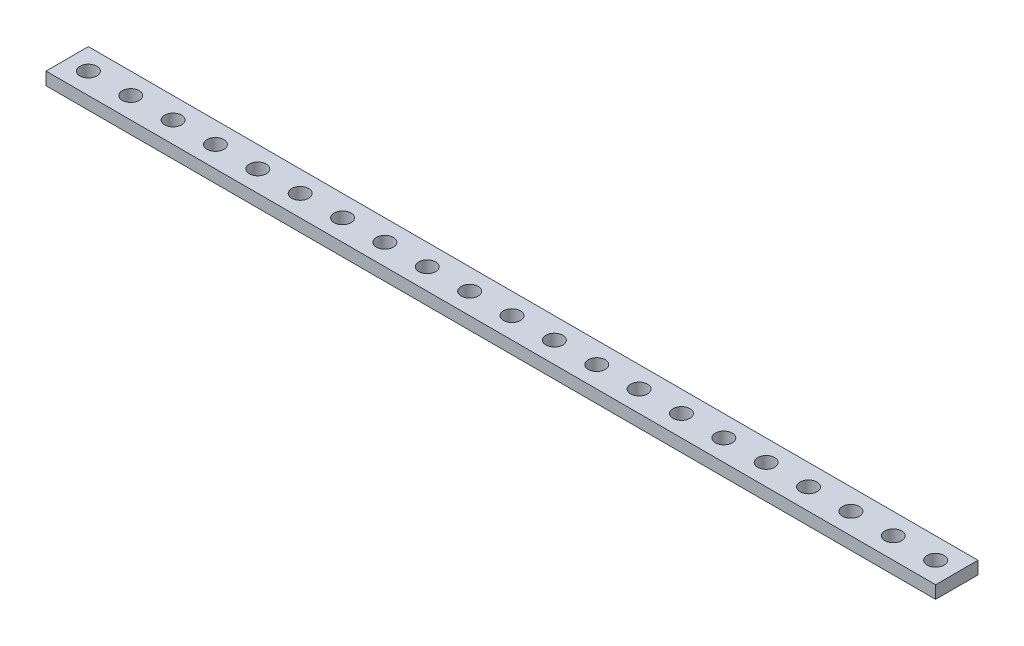
ISO-10303-21;
HEADER;
FILE_DESCRIPTION(('STEP AP214'),'2;1');
FILE_NAME('part.step','',(''),(''),'','','');
FILE_SCHEMA(('AUTOMOTIVE_DESIGN { 1 0 10303 214 1 1 1 1 }'));
ENDSEC;
DATA;
#1=APPLICATION_CONTEXT('core data for automotive mechanical design processes');
#2=APPLICATION_PROTOCOL_DEFINITION('international standard','automotive_design',2000,#1);
#3=PRODUCT_CONTEXT('',#1,'mechanical');
#4=PRODUCT('Part','Part','',(#3));
#5=PRODUCT_RELATED_PRODUCT_CATEGORY('part','',(#4));
#6=PRODUCT_DEFINITION_FORMATION('','',#4);
#7=PRODUCT_DEFINITION_CONTEXT('part definition',#1,'design');
#8=PRODUCT_DEFINITION('design','',#6,#7);
#9=PRODUCT_DEFINITION_SHAPE('','',#8);
#10=(LENGTH_UNIT() NAMED_UNIT(*) SI_UNIT(.MILLI.,.METRE.));
#11=(NAMED_UNIT(*) PLANE_ANGLE_UNIT() SI_UNIT($,.RADIAN.));
#12=(NAMED_UNIT(*) SI_UNIT($,.STERADIAN.) SOLID_ANGLE_UNIT());
#13=UNCERTAINTY_MEASURE_WITH_UNIT(LENGTH_MEASURE(1.E-05),#10,'distance_accuracy_value','');
#14=(GEOMETRIC_REPRESENTATION_CONTEXT(3) GLOBAL_UNCERTAINTY_ASSIGNED_CONTEXT((#13)) GLOBAL_UNIT_ASSIGNED_CONTEXT((#10,
#11,#12)) REPRESENTATION_CONTEXT('',''));
#15=CARTESIAN_POINT('',(0.,0.,0.));
#16=DIRECTION('',(0.,0.,1.));
#17=DIRECTION('',(1.,0.,0.));
#18=AXIS2_PLACEMENT_3D('',#15,#16,#17);
#19=CARTESIAN_POINT('',(0.,3.,0.));
#20=DIRECTION('',(0.,-1.,0.));
#21=DIRECTION('',(0.,0.,-1.));
#22=AXIS2_PLACEMENT_3D('',#19,#20,#21);
#23=PLANE('',#22);
#24=DIRECTION('',(1.,0.,0.));
#25=VECTOR('',#24,1.);
#26=CARTESIAN_POINT('',(0.,3.,0.));
#27=LINE('',#26,#25);
#28=CARTESIAN_POINT('',(-140.,3.,0.));
#29=VERTEX_POINT('',#28);
#30=CARTESIAN_POINT('',(70.,3.,0.));
#31=VERTEX_POINT('',#30);
#32=EDGE_CURVE('E89',#29,#31,#27,.T.);
#33=ORIENTED_EDGE('',*,*,#32,.T.);
#34=DIRECTION('',(0.,0.,1.));
#35=VECTOR('',#34,1.);
#36=CARTESIAN_POINT('',(70.,3.,-10.));
#37=LINE('',#36,#35);
#38=CARTESIAN_POINT('',(70.,3.,-10.));
#39=VERTEX_POINT('',#38);
#40=EDGE_CURVE('E226',#39,#31,#37,.T.);
#41=ORIENTED_EDGE('',*,*,#40,.F.);
#42=DIRECTION('',(-1.,0.,0.));
#43=VECTOR('',#42,1.);
#44=CARTESIAN_POINT('',(-140.,3.,-9.99999999999998));
#45=LINE('',#44,#43);
#46=CARTESIAN_POINT('',(-140.,3.,-9.99999999999998));
#47=VERTEX_POINT('',#46);
#48=EDGE_CURVE('E91',#39,#47,#45,.T.);
#49=ORIENTED_EDGE('',*,*,#48,.T.);
#50=DIRECTION('',(0.,0.,1.));
#51=VECTOR('',#50,1.);
#52=CARTESIAN_POINT('',(-140.,3.,0.));
#53=LINE('',#52,#51);
#54=EDGE_CURVE('E60',#47,#29,#53,.T.);
#55=ORIENTED_EDGE('',*,*,#54,.T.);
#56=EDGE_LOOP('',(#33,#41,#49,#55));
#57=FACE_BOUND('',#56,.T.);
#58=CARTESIAN_POINT('',(-135.,3.,-4.99999999999998));
#59=DIRECTION('',(0.,1.,0.));
#60=DIRECTION('',(0.,0.,1.));
#61=AXIS2_PLACEMENT_3D('',#58,#59,#60);
#62=CIRCLE('',#61,2.);
#63=CARTESIAN_POINT('',(-135.,3.,-2.99999999999999));
#64=VERTEX_POINT('',#63);
#65=EDGE_CURVE('E83',#64,#64,#62,.T.);
#66=ORIENTED_EDGE('',*,*,#65,.F.);
#67=EDGE_LOOP('',(#66));
#68=FACE_BOUND('',#67,.T.);
#69=CARTESIAN_POINT('',(-125.,3.,-4.99999999999998));
#70=DIRECTION('',(0.,1.,0.));
#71=DIRECTION('',(0.,0.,1.));
#72=AXIS2_PLACEMENT_3D('',#69,#70,#71);
#73=CIRCLE('',#72,1.99999999999998);
#74=CARTESIAN_POINT('',(-125.,3.,-3.));
#75=VERTEX_POINT('',#74);
#76=EDGE_CURVE('E100',#75,#75,#73,.T.);
#77=ORIENTED_EDGE('',*,*,#76,.F.);
#78=EDGE_LOOP('',(#77));
#79=FACE_BOUND('',#78,.T.);
#80=CARTESIAN_POINT('',(-115.,3.,-4.99999999999998));
#81=DIRECTION('',(0.,1.,0.));
#82=DIRECTION('',(0.,0.,1.));
#83=AXIS2_PLACEMENT_3D('',#80,#81,#82);
#84=CIRCLE('',#83,2.);
#85=CARTESIAN_POINT('',(-115.,3.,-2.99999999999999));
#86=VERTEX_POINT('',#85);
#87=EDGE_CURVE('E106',#86,#86,#84,.T.);
#88=ORIENTED_EDGE('',*,*,#87,.F.);
#89=EDGE_LOOP('',(#88));
#90=FACE_BOUND('',#89,.T.);
#91=CARTESIAN_POINT('',(-105.,3.,-4.99999999999998));
#92=DIRECTION('',(0.,1.,0.));
#93=DIRECTION('',(0.,0.,1.));
#94=AXIS2_PLACEMENT_3D('',#91,#92,#93);
#95=CIRCLE('',#94,2.);
#96=CARTESIAN_POINT('',(-105.,3.,-2.99999999999999));
#97=VERTEX_POINT('',#96);
#98=EDGE_CURVE('E112',#97,#97,#95,.T.);
#99=ORIENTED_EDGE('',*,*,#98,.F.);
#100=EDGE_LOOP('',(#99));
#101=FACE_BOUND('',#100,.T.);
#102=CARTESIAN_POINT('',(-95.,3.,-4.99999999999998));
#103=DIRECTION('',(0.,1.,0.));
#104=DIRECTION('',(0.,0.,1.));
#105=AXIS2_PLACEMENT_3D('',#102,#103,#104);
#106=CIRCLE('',#105,2.);
#107=CARTESIAN_POINT('',(-95.,3.,-2.99999999999999));
#108=VERTEX_POINT('',#107);
#109=EDGE_CURVE('E118',#108,#108,#106,.T.);
#110=ORIENTED_EDGE('',*,*,#109,.F.);
#111=EDGE_LOOP('',(#110));
#112=FACE_BOUND('',#111,.T.);
#113=CARTESIAN_POINT('',(-85.,3.,-4.99999999999998));
#114=DIRECTION('',(0.,1.,0.));
#115=DIRECTION('',(0.,0.,1.));
#116=AXIS2_PLACEMENT_3D('',#113,#114,#115);
#117=CIRCLE('',#116,2.);
#118=CARTESIAN_POINT('',(-85.,3.,-2.99999999999999));
#119=VERTEX_POINT('',#118);
#120=EDGE_CURVE('E124',#119,#119,#117,.T.);
#121=ORIENTED_EDGE('',*,*,#120,.F.);
#122=EDGE_LOOP('',(#121));
#123=FACE_BOUND('',#122,.T.);
#124=CARTESIAN_POINT('',(-75.,3.,-4.99999999999998));
#125=DIRECTION('',(0.,1.,0.));
#126=DIRECTION('',(0.,0.,1.));
#127=AXIS2_PLACEMENT_3D('',#124,#125,#126);
#128=CIRCLE('',#127,2.);
#129=CARTESIAN_POINT('',(-75.,3.,-2.99999999999999));
#130=VERTEX_POINT('',#129);
#131=EDGE_CURVE('E130',#130,#130,#128,.T.);
#132=ORIENTED_EDGE('',*,*,#131,.F.);
#133=EDGE_LOOP('',(#132));
#134=FACE_BOUND('',#133,.T.);
#135=CARTESIAN_POINT('',(-65.,3.,-4.99999999999998));
#136=DIRECTION('',(0.,1.,0.));
#137=DIRECTION('',(0.,0.,1.));
#138=AXIS2_PLACEMENT_3D('',#135,#136,#137);
#139=CIRCLE('',#138,2.);
#140=CARTESIAN_POINT('',(-65.,3.,-2.99999999999999));
#141=VERTEX_POINT('',#140);
#142=EDGE_CURVE('E136',#141,#141,#139,.T.);
#143=ORIENTED_EDGE('',*,*,#142,.F.);
#144=EDGE_LOOP('',(#143));
#145=FACE_BOUND('',#144,.T.);
#146=CARTESIAN_POINT('',(-55.,3.,-4.99999999999998));
#147=DIRECTION('',(0.,1.,0.));
#148=DIRECTION('',(0.,0.,1.));
#149=AXIS2_PLACEMENT_3D('',#146,#147,#148);
#150=CIRCLE('',#149,2.);
#151=CARTESIAN_POINT('',(-55.,3.,-2.99999999999999));
#152=VERTEX_POINT('',#151);
#153=EDGE_CURVE('E142',#152,#152,#150,.T.);
#154=ORIENTED_EDGE('',*,*,#153,.F.);
#155=EDGE_LOOP('',(#154));
#156=FACE_BOUND('',#155,.T.);
#157=CARTESIAN_POINT('',(-45.,3.,-4.99999999999998));
#158=DIRECTION('',(0.,1.,0.));
#159=DIRECTION('',(0.,0.,1.));
#160=AXIS2_PLACEMENT_3D('',#157,#158,#159);
#161=CIRCLE('',#160,2.);
#162=CARTESIAN_POINT('',(-45.,3.,-2.99999999999999));
#163=VERTEX_POINT('',#162);
#164=EDGE_CURVE('E148',#163,#163,#161,.T.);
#165=ORIENTED_EDGE('',*,*,#164,.F.);
#166=EDGE_LOOP('',(#165));
#167=FACE_BOUND('',#166,.T.);
#168=CARTESIAN_POINT('',(-35.,3.,-4.99999999999998));
#169=DIRECTION('',(0.,1.,0.));
#170=DIRECTION('',(0.,0.,1.));
#171=AXIS2_PLACEMENT_3D('',#168,#169,#170);
#172=CIRCLE('',#171,2.);
#173=CARTESIAN_POINT('',(-35.,3.,-2.99999999999999));
#174=VERTEX_POINT('',#173);
#175=EDGE_CURVE('E154',#174,#174,#172,.T.);
#176=ORIENTED_EDGE('',*,*,#175,.F.);
#177=EDGE_LOOP('',(#176));
#178=FACE_BOUND('',#177,.T.);
#179=CARTESIAN_POINT('',(-25.,3.,-4.99999999999998));
#180=DIRECTION('',(0.,1.,0.));
#181=DIRECTION('',(0.,0.,1.));
#182=AXIS2_PLACEMENT_3D('',#179,#180,#181);
#183=CIRCLE('',#182,2.);
#184=CARTESIAN_POINT('',(-25.,3.,-2.99999999999999));
#185=VERTEX_POINT('',#184);
#186=EDGE_CURVE('E160',#185,#185,#183,.T.);
#187=ORIENTED_EDGE('',*,*,#186,.F.);
#188=EDGE_LOOP('',(#187));
#189=FACE_BOUND('',#188,.T.);
#190=CARTESIAN_POINT('',(-15.,3.,-4.99999999999998));
#191=DIRECTION('',(0.,1.,0.));
#192=DIRECTION('',(0.,0.,1.));
#193=AXIS2_PLACEMENT_3D('',#190,#191,#192);
#194=CIRCLE('',#193,2.);
#195=CARTESIAN_POINT('',(-15.,3.,-2.99999999999999));
#196=VERTEX_POINT('',#195);
#197=EDGE_CURVE('E166',#196,#196,#194,.T.);
#198=ORIENTED_EDGE('',*,*,#197,.F.);
#199=EDGE_LOOP('',(#198));
#200=FACE_BOUND('',#199,.T.);
#201=CARTESIAN_POINT('',(-5.,3.,-4.99999999999998));
#202=DIRECTION('',(0.,1.,0.));
#203=DIRECTION('',(0.,0.,1.));
#204=AXIS2_PLACEMENT_3D('',#201,#202,#203);
#205=CIRCLE('',#204,2.);
#206=CARTESIAN_POINT('',(-5.,3.,-2.99999999999999));
#207=VERTEX_POINT('',#206);
#208=EDGE_CURVE('E172',#207,#207,#205,.T.);
#209=ORIENTED_EDGE('',*,*,#208,.F.);
#210=EDGE_LOOP('',(#209));
#211=FACE_BOUND('',#210,.T.);
#212=CARTESIAN_POINT('',(5.,3.,-4.99999999999998));
#213=DIRECTION('',(0.,1.,0.));
#214=DIRECTION('',(0.,0.,1.));
#215=AXIS2_PLACEMENT_3D('',#212,#213,#214);
#216=CIRCLE('',#215,2.);
#217=CARTESIAN_POINT('',(5.,3.,-2.99999999999999));
#218=VERTEX_POINT('',#217);
#219=EDGE_CURVE('E178',#218,#218,#216,.T.);
#220=ORIENTED_EDGE('',*,*,#219,.F.);
#221=EDGE_LOOP('',(#220));
#222=FACE_BOUND('',#221,.T.);
#223=CARTESIAN_POINT('',(15.,3.,-4.99999999999998));
#224=DIRECTION('',(0.,1.,0.));
#225=DIRECTION('',(0.,0.,1.));
#226=AXIS2_PLACEMENT_3D('',#223,#224,#225);
#227=CIRCLE('',#226,2.);
#228=CARTESIAN_POINT('',(15.,3.,-2.99999999999999));
#229=VERTEX_POINT('',#228);
#230=EDGE_CURVE('E184',#229,#229,#227,.T.);
#231=ORIENTED_EDGE('',*,*,#230,.F.);
#232=EDGE_LOOP('',(#231));
#233=FACE_BOUND('',#232,.T.);
#234=CARTESIAN_POINT('',(25.,3.,-4.99999999999998));
#235=DIRECTION('',(0.,1.,0.));
#236=DIRECTION('',(0.,0.,1.));
#237=AXIS2_PLACEMENT_3D('',#234,#235,#236);
#238=CIRCLE('',#237,2.);
#239=CARTESIAN_POINT('',(25.,3.,-2.99999999999999));
#240=VERTEX_POINT('',#239);
#241=EDGE_CURVE('E190',#240,#240,#238,.T.);
#242=ORIENTED_EDGE('',*,*,#241,.F.);
#243=EDGE_LOOP('',(#242));
#244=FACE_BOUND('',#243,.T.);
#245=CARTESIAN_POINT('',(35.,3.,-4.99999999999998));
#246=DIRECTION('',(0.,1.,0.));
#247=DIRECTION('',(0.,0.,1.));
#248=AXIS2_PLACEMENT_3D('',#245,#246,#247);
#249=CIRCLE('',#248,2.);
#250=CARTESIAN_POINT('',(35.,3.,-2.99999999999999));
#251=VERTEX_POINT('',#250);
#252=EDGE_CURVE('E196',#251,#251,#249,.T.);
#253=ORIENTED_EDGE('',*,*,#252,.F.);
#254=EDGE_LOOP('',(#253));
#255=FACE_BOUND('',#254,.T.);
#256=CARTESIAN_POINT('',(45.,3.,-4.99999999999998));
#257=DIRECTION('',(0.,1.,0.));
#258=DIRECTION('',(0.,0.,1.));
#259=AXIS2_PLACEMENT_3D('',#256,#257,#258);
#260=CIRCLE('',#259,2.);
#261=CARTESIAN_POINT('',(45.,3.,-2.99999999999999));
#262=VERTEX_POINT('',#261);
#263=EDGE_CURVE('E202',#262,#262,#260,.T.);
#264=ORIENTED_EDGE('',*,*,#263,.F.);
#265=EDGE_LOOP('',(#264));
#266=FACE_BOUND('',#265,.T.);
#267=CARTESIAN_POINT('',(55.,3.,-4.99999999999998));
#268=DIRECTION('',(0.,1.,0.));
#269=DIRECTION('',(0.,0.,1.));
#270=AXIS2_PLACEMENT_3D('',#267,#268,#269);
#271=CIRCLE('',#270,2.);
#272=CARTESIAN_POINT('',(55.,3.,-2.99999999999999));
#273=VERTEX_POINT('',#272);
#274=EDGE_CURVE('E208',#273,#273,#271,.T.);
#275=ORIENTED_EDGE('',*,*,#274,.F.);
#276=EDGE_LOOP('',(#275));
#277=FACE_BOUND('',#276,.T.);
#278=CARTESIAN_POINT('',(65.,3.,-4.99999999999998));
#279=DIRECTION('',(0.,1.,0.));
#280=DIRECTION('',(0.,0.,1.));
#281=AXIS2_PLACEMENT_3D('',#278,#279,#280);
#282=CIRCLE('',#281,2.);
#283=CARTESIAN_POINT('',(65.,3.,-2.99999999999999));
#284=VERTEX_POINT('',#283);
#285=EDGE_CURVE('E214',#284,#284,#282,.T.);
#286=ORIENTED_EDGE('',*,*,#285,.F.);
#287=EDGE_LOOP('',(#286));
#288=FACE_BOUND('',#287,.T.);
#289=ADVANCED_FACE('F36',(#57,#68,#79,#90,#101,#112,#123,#134,#145,#156,#167,#178,#189,#200,
#211,#222,#233,#244,#255,#266,#277,#288),#23,.F.);
#290=CARTESIAN_POINT('',(0.,0.,0.));
#291=DIRECTION('',(0.,-1.,0.));
#292=DIRECTION('',(0.,0.,-1.));
#293=AXIS2_PLACEMENT_3D('',#290,#291,#292);
#294=PLANE('',#293);
#295=DIRECTION('',(0.,0.,1.));
#296=VECTOR('',#295,1.);
#297=CARTESIAN_POINT('',(70.,0.,-10.));
#298=LINE('',#297,#296);
#299=CARTESIAN_POINT('',(70.,0.,-9.99999999999998));
#300=VERTEX_POINT('',#299);
#301=CARTESIAN_POINT('',(70.,0.,0.));
#302=VERTEX_POINT('',#301);
#303=EDGE_CURVE('E51',#300,#302,#298,.T.);
#304=ORIENTED_EDGE('',*,*,#303,.T.);
#305=DIRECTION('',(1.,0.,0.));
#306=VECTOR('',#305,1.);
#307=CARTESIAN_POINT('',(0.,0.,0.));
#308=LINE('',#307,#306);
#309=CARTESIAN_POINT('',(-140.,0.,0.));
#310=VERTEX_POINT('',#309);
#311=EDGE_CURVE('E73',#310,#302,#308,.T.);
#312=ORIENTED_EDGE('',*,*,#311,.F.);
#313=DIRECTION('',(0.,0.,1.));
#314=VECTOR('',#313,1.);
#315=CARTESIAN_POINT('',(-140.,0.,0.));
#316=LINE('',#315,#314);
#317=CARTESIAN_POINT('',(-140.,0.,-9.99999999999998));
#318=VERTEX_POINT('',#317);
#319=EDGE_CURVE('E78',#318,#310,#316,.T.);
#320=ORIENTED_EDGE('',*,*,#319,.F.);
#321=DIRECTION('',(-1.,0.,0.));
#322=VECTOR('',#321,1.);
#323=CARTESIAN_POINT('',(-140.,0.,-9.99999999999998));
#324=LINE('',#323,#322);
#325=EDGE_CURVE('E82',#300,#318,#324,.T.);
#326=ORIENTED_EDGE('',*,*,#325,.F.);
#327=EDGE_LOOP('',(#304,#312,#320,#326));
#328=FACE_BOUND('',#327,.T.);
#329=CARTESIAN_POINT('',(65.,0.,-4.99999999999998));
#330=DIRECTION('',(0.,1.,0.));
#331=DIRECTION('',(0.,0.,1.));
#332=AXIS2_PLACEMENT_3D('',#329,#330,#331);
#333=CIRCLE('',#332,2.);
#334=CARTESIAN_POINT('',(65.,0.,-2.99999999999999));
#335=VERTEX_POINT('',#334);
#336=EDGE_CURVE('E217',#335,#335,#333,.T.);
#337=ORIENTED_EDGE('',*,*,#336,.T.);
#338=EDGE_LOOP('',(#337));
#339=FACE_BOUND('',#338,.T.);
#340=CARTESIAN_POINT('',(45.,0.,-4.99999999999998));
#341=DIRECTION('',(0.,1.,0.));
#342=DIRECTION('',(0.,0.,1.));
#343=AXIS2_PLACEMENT_3D('',#340,#341,#342);
#344=CIRCLE('',#343,2.);
#345=CARTESIAN_POINT('',(45.,0.,-2.99999999999999));
#346=VERTEX_POINT('',#345);
#347=EDGE_CURVE('E205',#346,#346,#344,.T.);
#348=ORIENTED_EDGE('',*,*,#347,.T.);
#349=EDGE_LOOP('',(#348));
#350=FACE_BOUND('',#349,.T.);
#351=CARTESIAN_POINT('',(25.,0.,-4.99999999999998));
#352=DIRECTION('',(0.,1.,0.));
#353=DIRECTION('',(0.,0.,1.));
#354=AXIS2_PLACEMENT_3D('',#351,#352,#353);
#355=CIRCLE('',#354,2.);
#356=CARTESIAN_POINT('',(25.,0.,-2.99999999999999));
#357=VERTEX_POINT('',#356);
#358=EDGE_CURVE('E193',#357,#357,#355,.T.);
#359=ORIENTED_EDGE('',*,*,#358,.T.);
#360=EDGE_LOOP('',(#359));
#361=FACE_BOUND('',#360,.T.);
#362=CARTESIAN_POINT('',(5.,0.,-4.99999999999998));
#363=DIRECTION('',(0.,1.,0.));
#364=DIRECTION('',(0.,0.,1.));
#365=AXIS2_PLACEMENT_3D('',#362,#363,#364);
#366=CIRCLE('',#365,2.);
#367=CARTESIAN_POINT('',(5.,0.,-2.99999999999999));
#368=VERTEX_POINT('',#367);
#369=EDGE_CURVE('E181',#368,#368,#366,.T.);
#370=ORIENTED_EDGE('',*,*,#369,.T.);
#371=EDGE_LOOP('',(#370));
#372=FACE_BOUND('',#371,.T.);
#373=CARTESIAN_POINT('',(-15.,0.,-4.99999999999998));
#374=DIRECTION('',(0.,1.,0.));
#375=DIRECTION('',(0.,0.,1.));
#376=AXIS2_PLACEMENT_3D('',#373,#374,#375);
#377=CIRCLE('',#376,2.);
#378=CARTESIAN_POINT('',(-15.,0.,-2.99999999999999));
#379=VERTEX_POINT('',#378);
#380=EDGE_CURVE('E169',#379,#379,#377,.T.);
#381=ORIENTED_EDGE('',*,*,#380,.T.);
#382=EDGE_LOOP('',(#381));
#383=FACE_BOUND('',#382,.T.);
#384=CARTESIAN_POINT('',(-35.,0.,-4.99999999999998));
#385=DIRECTION('',(0.,1.,0.));
#386=DIRECTION('',(0.,0.,1.));
#387=AXIS2_PLACEMENT_3D('',#384,#385,#386);
#388=CIRCLE('',#387,2.);
#389=CARTESIAN_POINT('',(-35.,0.,-2.99999999999999));
#390=VERTEX_POINT('',#389);
#391=EDGE_CURVE('E157',#390,#390,#388,.T.);
#392=ORIENTED_EDGE('',*,*,#391,.T.);
#393=EDGE_LOOP('',(#392));
#394=FACE_BOUND('',#393,.T.);
#395=CARTESIAN_POINT('',(-55.,0.,-4.99999999999998));
#396=DIRECTION('',(0.,1.,0.));
#397=DIRECTION('',(0.,0.,1.));
#398=AXIS2_PLACEMENT_3D('',#395,#396,#397);
#399=CIRCLE('',#398,2.);
#400=CARTESIAN_POINT('',(-55.,0.,-2.99999999999999));
#401=VERTEX_POINT('',#400);
#402=EDGE_CURVE('E145',#401,#401,#399,.T.);
#403=ORIENTED_EDGE('',*,*,#402,.T.);
#404=EDGE_LOOP('',(#403));
#405=FACE_BOUND('',#404,.T.);
#406=CARTESIAN_POINT('',(-75.,0.,-4.99999999999998));
#407=DIRECTION('',(0.,1.,0.));
#408=DIRECTION('',(0.,0.,1.));
#409=AXIS2_PLACEMENT_3D('',#406,#407,#408);
#410=CIRCLE('',#409,2.);
#411=CARTESIAN_POINT('',(-75.,0.,-2.99999999999999));
#412=VERTEX_POINT('',#411);
#413=EDGE_CURVE('E133',#412,#412,#410,.T.);
#414=ORIENTED_EDGE('',*,*,#413,.T.);
#415=EDGE_LOOP('',(#414));
#416=FACE_BOUND('',#415,.T.);
#417=CARTESIAN_POINT('',(-95.,0.,-4.99999999999998));
#418=DIRECTION('',(0.,1.,0.));
#419=DIRECTION('',(0.,0.,1.));
#420=AXIS2_PLACEMENT_3D('',#417,#418,#419);
#421=CIRCLE('',#420,2.);
#422=CARTESIAN_POINT('',(-95.,0.,-2.99999999999999));
#423=VERTEX_POINT('',#422);
#424=EDGE_CURVE('E121',#423,#423,#421,.T.);
#425=ORIENTED_EDGE('',*,*,#424,.T.);
#426=EDGE_LOOP('',(#425));
#427=FACE_BOUND('',#426,.T.);
#428=CARTESIAN_POINT('',(-115.,0.,-4.99999999999998));
#429=DIRECTION('',(0.,1.,0.));
#430=DIRECTION('',(0.,0.,1.));
#431=AXIS2_PLACEMENT_3D('',#428,#429,#430);
#432=CIRCLE('',#431,2.);
#433=CARTESIAN_POINT('',(-115.,0.,-2.99999999999999));
#434=VERTEX_POINT('',#433);
#435=EDGE_CURVE('E109',#434,#434,#432,.T.);
#436=ORIENTED_EDGE('',*,*,#435,.T.);
#437=EDGE_LOOP('',(#436));
#438=FACE_BOUND('',#437,.T.);
#439=CARTESIAN_POINT('',(-135.,0.,-4.99999999999998));
#440=DIRECTION('',(0.,1.,0.));
#441=DIRECTION('',(0.,0.,1.));
#442=AXIS2_PLACEMENT_3D('',#439,#440,#441);
#443=CIRCLE('',#442,2.);
#444=CARTESIAN_POINT('',(-135.,0.,-2.99999999999999));
#445=VERTEX_POINT('',#444);
#446=EDGE_CURVE('E97',#445,#445,#443,.T.);
#447=ORIENTED_EDGE('',*,*,#446,.T.);
#448=EDGE_LOOP('',(#447));
#449=FACE_BOUND('',#448,.T.);
#450=CARTESIAN_POINT('',(-125.,0.,-4.99999999999998));
#451=DIRECTION('',(0.,1.,0.));
#452=DIRECTION('',(0.,0.,1.));
#453=AXIS2_PLACEMENT_3D('',#450,#451,#452);
#454=CIRCLE('',#453,1.99999999999998);
#455=CARTESIAN_POINT('',(-125.,0.,-3.));
#456=VERTEX_POINT('',#455);
#457=EDGE_CURVE('E103',#456,#456,#454,.T.);
#458=ORIENTED_EDGE('',*,*,#457,.T.);
#459=EDGE_LOOP('',(#458));
#460=FACE_BOUND('',#459,.T.);
#461=CARTESIAN_POINT('',(-105.,0.,-4.99999999999998));
#462=DIRECTION('',(0.,1.,0.));
#463=DIRECTION('',(0.,0.,1.));
#464=AXIS2_PLACEMENT_3D('',#461,#462,#463);
#465=CIRCLE('',#464,2.);
#466=CARTESIAN_POINT('',(-105.,0.,-2.99999999999999));
#467=VERTEX_POINT('',#466);
#468=EDGE_CURVE('E115',#467,#467,#465,.T.);
#469=ORIENTED_EDGE('',*,*,#468,.T.);
#470=EDGE_LOOP('',(#469));
#471=FACE_BOUND('',#470,.T.);
#472=CARTESIAN_POINT('',(-85.,0.,-4.99999999999998));
#473=DIRECTION('',(0.,1.,0.));
#474=DIRECTION('',(0.,0.,1.));
#475=AXIS2_PLACEMENT_3D('',#472,#473,#474);
#476=CIRCLE('',#475,2.);
#477=CARTESIAN_POINT('',(-85.,0.,-2.99999999999999));
#478=VERTEX_POINT('',#477);
#479=EDGE_CURVE('E127',#478,#478,#476,.T.);
#480=ORIENTED_EDGE('',*,*,#479,.T.);
#481=EDGE_LOOP('',(#480));
#482=FACE_BOUND('',#481,.T.);
#483=CARTESIAN_POINT('',(-65.,0.,-4.99999999999998));
#484=DIRECTION('',(0.,1.,0.));
#485=DIRECTION('',(0.,0.,1.));
#486=AXIS2_PLACEMENT_3D('',#483,#484,#485);
#487=CIRCLE('',#486,2.);
#488=CARTESIAN_POINT('',(-65.,0.,-2.99999999999999));
#489=VERTEX_POINT('',#488);
#490=EDGE_CURVE('E139',#489,#489,#487,.T.);
#491=ORIENTED_EDGE('',*,*,#490,.T.);
#492=EDGE_LOOP('',(#491));
#493=FACE_BOUND('',#492,.T.);
#494=CARTESIAN_POINT('',(-45.,0.,-4.99999999999998));
#495=DIRECTION('',(0.,1.,0.));
#496=DIRECTION('',(0.,0.,1.));
#497=AXIS2_PLACEMENT_3D('',#494,#495,#496);
#498=CIRCLE('',#497,2.);
#499=CARTESIAN_POINT('',(-45.,0.,-2.99999999999999));
#500=VERTEX_POINT('',#499);
#501=EDGE_CURVE('E151',#500,#500,#498,.T.);
#502=ORIENTED_EDGE('',*,*,#501,.T.);
#503=EDGE_LOOP('',(#502));
#504=FACE_BOUND('',#503,.T.);
#505=CARTESIAN_POINT('',(-25.,0.,-4.99999999999998));
#506=DIRECTION('',(0.,1.,0.));
#507=DIRECTION('',(0.,0.,1.));
#508=AXIS2_PLACEMENT_3D('',#505,#506,#507);
#509=CIRCLE('',#508,2.);
#510=CARTESIAN_POINT('',(-25.,0.,-2.99999999999999));
#511=VERTEX_POINT('',#510);
#512=EDGE_CURVE('E163',#511,#511,#509,.T.);
#513=ORIENTED_EDGE('',*,*,#512,.T.);
#514=EDGE_LOOP('',(#513));
#515=FACE_BOUND('',#514,.T.);
#516=CARTESIAN_POINT('',(-5.,0.,-4.99999999999998));
#517=DIRECTION('',(0.,1.,0.));
#518=DIRECTION('',(0.,0.,1.));
#519=AXIS2_PLACEMENT_3D('',#516,#517,#518);
#520=CIRCLE('',#519,2.);
#521=CARTESIAN_POINT('',(-5.,0.,-2.99999999999999));
#522=VERTEX_POINT('',#521);
#523=EDGE_CURVE('E175',#522,#522,#520,.T.);
#524=ORIENTED_EDGE('',*,*,#523,.T.);
#525=EDGE_LOOP('',(#524));
#526=FACE_BOUND('',#525,.T.);
#527=CARTESIAN_POINT('',(15.,0.,-4.99999999999998));
#528=DIRECTION('',(0.,1.,0.));
#529=DIRECTION('',(0.,0.,1.));
#530=AXIS2_PLACEMENT_3D('',#527,#528,#529);
#531=CIRCLE('',#530,2.);
#532=CARTESIAN_POINT('',(15.,0.,-2.99999999999999));
#533=VERTEX_POINT('',#532);
#534=EDGE_CURVE('E187',#533,#533,#531,.T.);
#535=ORIENTED_EDGE('',*,*,#534,.T.);
#536=EDGE_LOOP('',(#535));
#537=FACE_BOUND('',#536,.T.);
#538=CARTESIAN_POINT('',(35.,0.,-4.99999999999998));
#539=DIRECTION('',(0.,1.,0.));
#540=DIRECTION('',(0.,0.,1.));
#541=AXIS2_PLACEMENT_3D('',#538,#539,#540);
#542=CIRCLE('',#541,2.);
#543=CARTESIAN_POINT('',(35.,0.,-2.99999999999999));
#544=VERTEX_POINT('',#543);
#545=EDGE_CURVE('E199',#544,#544,#542,.T.);
#546=ORIENTED_EDGE('',*,*,#545,.T.);
#547=EDGE_LOOP('',(#546));
#548=FACE_BOUND('',#547,.T.);
#549=CARTESIAN_POINT('',(55.,0.,-4.99999999999998));
#550=DIRECTION('',(0.,1.,0.));
#551=DIRECTION('',(0.,0.,1.));
#552=AXIS2_PLACEMENT_3D('',#549,#550,#551);
#553=CIRCLE('',#552,2.);
#554=CARTESIAN_POINT('',(55.,0.,-2.99999999999999));
#555=VERTEX_POINT('',#554);
#556=EDGE_CURVE('E211',#555,#555,#553,.T.);
#557=ORIENTED_EDGE('',*,*,#556,.T.);
#558=EDGE_LOOP('',(#557));
#559=FACE_BOUND('',#558,.T.);
#560=ADVANCED_FACE('F75',(#328,#339,#350,#361,#372,#383,#394,#405,#416,#427,#438,#449,#460,#471,
#482,#493,#504,#515,#526,#537,#548,#559),#294,.T.);
#561=CARTESIAN_POINT('',(0.,3.,0.));
#562=DIRECTION('',(0.,0.,-1.));
#563=DIRECTION('',(-1.,0.,0.));
#564=AXIS2_PLACEMENT_3D('',#561,#562,#563);
#565=PLANE('',#564);
#566=ORIENTED_EDGE('',*,*,#311,.T.);
#567=DIRECTION('',(0.,1.,0.));
#568=VECTOR('',#567,1.);
#569=CARTESIAN_POINT('',(70.,-0.00100000000000013,0.));
#570=LINE('',#569,#568);
#571=EDGE_CURVE('E223',#302,#31,#570,.T.);
#572=ORIENTED_EDGE('',*,*,#571,.T.);
#573=ORIENTED_EDGE('',*,*,#32,.F.);
#574=DIRECTION('',(0.,-1.,0.));
#575=VECTOR('',#574,1.);
#576=CARTESIAN_POINT('',(-140.,3.,0.));
#577=LINE('',#576,#575);
#578=EDGE_CURVE('E44',#29,#310,#577,.T.);
#579=ORIENTED_EDGE('',*,*,#578,.T.);
#580=EDGE_LOOP('',(#566,#572,#573,#579));
#581=FACE_BOUND('',#580,.T.);
#582=ADVANCED_FACE('F38',(#581),#565,.F.);
#583=CARTESIAN_POINT('',(-140.,3.,-9.99999999999998));
#584=DIRECTION('',(0.,0.,1.));
#585=DIRECTION('',(1.,0.,0.));
#586=AXIS2_PLACEMENT_3D('',#583,#584,#585);
#587=PLANE('',#586);
#588=ORIENTED_EDGE('',*,*,#48,.F.);
#589=DIRECTION('',(0.,1.,0.));
#590=VECTOR('',#589,1.);
#591=CARTESIAN_POINT('',(70.,-0.00100000000000013,-10.));
#592=LINE('',#591,#590);
#593=EDGE_CURVE('E224',#300,#39,#592,.T.);
#594=ORIENTED_EDGE('',*,*,#593,.F.);
#595=ORIENTED_EDGE('',*,*,#325,.T.);
#596=DIRECTION('',(0.,-1.,0.));
#597=VECTOR('',#596,1.);
#598=CARTESIAN_POINT('',(-140.,3.,-9.99999999999998));
#599=LINE('',#598,#597);
#600=EDGE_CURVE('E11',#47,#318,#599,.T.);
#601=ORIENTED_EDGE('',*,*,#600,.F.);
#602=EDGE_LOOP('',(#588,#594,#595,#601));
#603=FACE_BOUND('',#602,.T.);
#604=ADVANCED_FACE('F413',(#603),#587,.F.);
#605=CARTESIAN_POINT('',(-140.,3.,0.));
#606=DIRECTION('',(1.,0.,0.));
#607=DIRECTION('',(0.,0.,-1.));
#608=AXIS2_PLACEMENT_3D('',#605,#606,#607);
#609=PLANE('',#608);
#610=ORIENTED_EDGE('',*,*,#319,.T.);
#611=ORIENTED_EDGE('',*,*,#578,.F.);
#612=ORIENTED_EDGE('',*,*,#54,.F.);
#613=ORIENTED_EDGE('',*,*,#600,.T.);
#614=EDGE_LOOP('',(#610,#611,#612,#613));
#615=FACE_BOUND('',#614,.T.);
#616=ADVANCED_FACE('F86',(#615),#609,.F.);
#617=CARTESIAN_POINT('',(-135.,3.,-4.99999999999998));
#618=DIRECTION('',(0.,-1.,0.));
#619=DIRECTION('',(0.,0.,-1.));
#620=AXIS2_PLACEMENT_3D('',#617,#618,#619);
#621=CYLINDRICAL_SURFACE('',#620,2.);
#622=ORIENTED_EDGE('',*,*,#65,.T.);
#623=EDGE_LOOP('',(#622));
#624=FACE_BOUND('',#623,.T.);
#625=ORIENTED_EDGE('',*,*,#446,.F.);
#626=EDGE_LOOP('',(#625));
#627=FACE_BOUND('',#626,.T.);
#628=ADVANCED_FACE('F407',(#624,#627),#621,.F.);
#629=CARTESIAN_POINT('',(-125.,3.,-4.99999999999998));
#630=DIRECTION('',(0.,-1.,0.));
#631=DIRECTION('',(0.,0.,-1.));
#632=AXIS2_PLACEMENT_3D('',#629,#630,#631);
#633=CYLINDRICAL_SURFACE('',#632,1.99999999999998);
#634=ORIENTED_EDGE('',*,*,#76,.T.);
#635=EDGE_LOOP('',(#634));
#636=FACE_BOUND('',#635,.T.);
#637=ORIENTED_EDGE('',*,*,#457,.F.);
#638=EDGE_LOOP('',(#637));
#639=FACE_BOUND('',#638,.T.);
#640=ADVANCED_FACE('F403',(#636,#639),#633,.F.);
#641=CARTESIAN_POINT('',(-115.,3.,-4.99999999999998));
#642=DIRECTION('',(0.,-1.,0.));
#643=DIRECTION('',(0.,0.,-1.));
#644=AXIS2_PLACEMENT_3D('',#641,#642,#643);
#645=CYLINDRICAL_SURFACE('',#644,2.);
#646=ORIENTED_EDGE('',*,*,#87,.T.);
#647=EDGE_LOOP('',(#646));
#648=FACE_BOUND('',#647,.T.);
#649=ORIENTED_EDGE('',*,*,#435,.F.);
#650=EDGE_LOOP('',(#649));
#651=FACE_BOUND('',#650,.T.);
#652=ADVANCED_FACE('F399',(#648,#651),#645,.F.);
#653=CARTESIAN_POINT('',(-105.,3.,-4.99999999999998));
#654=DIRECTION('',(0.,-1.,0.));
#655=DIRECTION('',(0.,0.,-1.));
#656=AXIS2_PLACEMENT_3D('',#653,#654,#655);
#657=CYLINDRICAL_SURFACE('',#656,2.);
#658=ORIENTED_EDGE('',*,*,#98,.T.);
#659=EDGE_LOOP('',(#658));
#660=FACE_BOUND('',#659,.T.);
#661=ORIENTED_EDGE('',*,*,#468,.F.);
#662=EDGE_LOOP('',(#661));
#663=FACE_BOUND('',#662,.T.);
#664=ADVANCED_FACE('F395',(#660,#663),#657,.F.);
#665=CARTESIAN_POINT('',(-95.,3.,-4.99999999999998));
#666=DIRECTION('',(0.,-1.,0.));
#667=DIRECTION('',(0.,0.,-1.));
#668=AXIS2_PLACEMENT_3D('',#665,#666,#667);
#669=CYLINDRICAL_SURFACE('',#668,2.);
#670=ORIENTED_EDGE('',*,*,#109,.T.);
#671=EDGE_LOOP('',(#670));
#672=FACE_BOUND('',#671,.T.);
#673=ORIENTED_EDGE('',*,*,#424,.F.);
#674=EDGE_LOOP('',(#673));
#675=FACE_BOUND('',#674,.T.);
#676=ADVANCED_FACE('F391',(#672,#675),#669,.F.);
#677=CARTESIAN_POINT('',(-85.,3.,-4.99999999999998));
#678=DIRECTION('',(0.,-1.,0.));
#679=DIRECTION('',(0.,0.,-1.));
#680=AXIS2_PLACEMENT_3D('',#677,#678,#679);
#681=CYLINDRICAL_SURFACE('',#680,2.);
#682=ORIENTED_EDGE('',*,*,#120,.T.);
#683=EDGE_LOOP('',(#682));
#684=FACE_BOUND('',#683,.T.);
#685=ORIENTED_EDGE('',*,*,#479,.F.);
#686=EDGE_LOOP('',(#685));
#687=FACE_BOUND('',#686,.T.);
#688=ADVANCED_FACE('F387',(#684,#687),#681,.F.);
#689=CARTESIAN_POINT('',(-75.,3.,-4.99999999999998));
#690=DIRECTION('',(0.,-1.,0.));
#691=DIRECTION('',(0.,0.,-1.));
#692=AXIS2_PLACEMENT_3D('',#689,#690,#691);
#693=CYLINDRICAL_SURFACE('',#692,2.);
#694=ORIENTED_EDGE('',*,*,#131,.T.);
#695=EDGE_LOOP('',(#694));
#696=FACE_BOUND('',#695,.T.);
#697=ORIENTED_EDGE('',*,*,#413,.F.);
#698=EDGE_LOOP('',(#697));
#699=FACE_BOUND('',#698,.T.);
#700=ADVANCED_FACE('F383',(#696,#699),#693,.F.);
#701=CARTESIAN_POINT('',(-65.,3.,-4.99999999999998));
#702=DIRECTION('',(0.,-1.,0.));
#703=DIRECTION('',(0.,0.,-1.));
#704=AXIS2_PLACEMENT_3D('',#701,#702,#703);
#705=CYLINDRICAL_SURFACE('',#704,2.);
#706=ORIENTED_EDGE('',*,*,#142,.T.);
#707=EDGE_LOOP('',(#706));
#708=FACE_BOUND('',#707,.T.);
#709=ORIENTED_EDGE('',*,*,#490,.F.);
#710=EDGE_LOOP('',(#709));
#711=FACE_BOUND('',#710,.T.);
#712=ADVANCED_FACE('F379',(#708,#711),#705,.F.);
#713=CARTESIAN_POINT('',(-55.,3.,-4.99999999999998));
#714=DIRECTION('',(0.,-1.,0.));
#715=DIRECTION('',(0.,0.,-1.));
#716=AXIS2_PLACEMENT_3D('',#713,#714,#715);
#717=CYLINDRICAL_SURFACE('',#716,2.);
#718=ORIENTED_EDGE('',*,*,#153,.T.);
#719=EDGE_LOOP('',(#718));
#720=FACE_BOUND('',#719,.T.);
#721=ORIENTED_EDGE('',*,*,#402,.F.);
#722=EDGE_LOOP('',(#721));
#723=FACE_BOUND('',#722,.T.);
#724=ADVANCED_FACE('F375',(#720,#723),#717,.F.);
#725=CARTESIAN_POINT('',(-45.,3.,-4.99999999999998));
#726=DIRECTION('',(0.,-1.,0.));
#727=DIRECTION('',(0.,0.,-1.));
#728=AXIS2_PLACEMENT_3D('',#725,#726,#727);
#729=CYLINDRICAL_SURFACE('',#728,2.);
#730=ORIENTED_EDGE('',*,*,#164,.T.);
#731=EDGE_LOOP('',(#730));
#732=FACE_BOUND('',#731,.T.);
#733=ORIENTED_EDGE('',*,*,#501,.F.);
#734=EDGE_LOOP('',(#733));
#735=FACE_BOUND('',#734,.T.);
#736=ADVANCED_FACE('F371',(#732,#735),#729,.F.);
#737=CARTESIAN_POINT('',(-35.,3.,-4.99999999999998));
#738=DIRECTION('',(0.,-1.,0.));
#739=DIRECTION('',(0.,0.,-1.));
#740=AXIS2_PLACEMENT_3D('',#737,#738,#739);
#741=CYLINDRICAL_SURFACE('',#740,2.);
#742=ORIENTED_EDGE('',*,*,#175,.T.);
#743=EDGE_LOOP('',(#742));
#744=FACE_BOUND('',#743,.T.);
#745=ORIENTED_EDGE('',*,*,#391,.F.);
#746=EDGE_LOOP('',(#745));
#747=FACE_BOUND('',#746,.T.);
#748=ADVANCED_FACE('F367',(#744,#747),#741,.F.);
#749=CARTESIAN_POINT('',(-25.,3.,-4.99999999999998));
#750=DIRECTION('',(0.,-1.,0.));
#751=DIRECTION('',(0.,0.,-1.));
#752=AXIS2_PLACEMENT_3D('',#749,#750,#751);
#753=CYLINDRICAL_SURFACE('',#752,2.);
#754=ORIENTED_EDGE('',*,*,#186,.T.);
#755=EDGE_LOOP('',(#754));
#756=FACE_BOUND('',#755,.T.);
#757=ORIENTED_EDGE('',*,*,#512,.F.);
#758=EDGE_LOOP('',(#757));
#759=FACE_BOUND('',#758,.T.);
#760=ADVANCED_FACE('F363',(#756,#759),#753,.F.);
#761=CARTESIAN_POINT('',(-15.,3.,-4.99999999999998));
#762=DIRECTION('',(0.,-1.,0.));
#763=DIRECTION('',(0.,0.,-1.));
#764=AXIS2_PLACEMENT_3D('',#761,#762,#763);
#765=CYLINDRICAL_SURFACE('',#764,2.);
#766=ORIENTED_EDGE('',*,*,#197,.T.);
#767=EDGE_LOOP('',(#766));
#768=FACE_BOUND('',#767,.T.);
#769=ORIENTED_EDGE('',*,*,#380,.F.);
#770=EDGE_LOOP('',(#769));
#771=FACE_BOUND('',#770,.T.);
#772=ADVANCED_FACE('F359',(#768,#771),#765,.F.);
#773=CARTESIAN_POINT('',(-5.,3.,-4.99999999999998));
#774=DIRECTION('',(0.,-1.,0.));
#775=DIRECTION('',(0.,0.,-1.));
#776=AXIS2_PLACEMENT_3D('',#773,#774,#775);
#777=CYLINDRICAL_SURFACE('',#776,2.);
#778=ORIENTED_EDGE('',*,*,#208,.T.);
#779=EDGE_LOOP('',(#778));
#780=FACE_BOUND('',#779,.T.);
#781=ORIENTED_EDGE('',*,*,#523,.F.);
#782=EDGE_LOOP('',(#781));
#783=FACE_BOUND('',#782,.T.);
#784=ADVANCED_FACE('F355',(#780,#783),#777,.F.);
#785=CARTESIAN_POINT('',(5.,3.,-4.99999999999998));
#786=DIRECTION('',(0.,-1.,0.));
#787=DIRECTION('',(0.,0.,-1.));
#788=AXIS2_PLACEMENT_3D('',#785,#786,#787);
#789=CYLINDRICAL_SURFACE('',#788,2.);
#790=ORIENTED_EDGE('',*,*,#219,.T.);
#791=EDGE_LOOP('',(#790));
#792=FACE_BOUND('',#791,.T.);
#793=ORIENTED_EDGE('',*,*,#369,.F.);
#794=EDGE_LOOP('',(#793));
#795=FACE_BOUND('',#794,.T.);
#796=ADVANCED_FACE('F351',(#792,#795),#789,.F.);
#797=CARTESIAN_POINT('',(15.,3.,-4.99999999999998));
#798=DIRECTION('',(0.,-1.,0.));
#799=DIRECTION('',(0.,0.,-1.));
#800=AXIS2_PLACEMENT_3D('',#797,#798,#799);
#801=CYLINDRICAL_SURFACE('',#800,2.);
#802=ORIENTED_EDGE('',*,*,#230,.T.);
#803=EDGE_LOOP('',(#802));
#804=FACE_BOUND('',#803,.T.);
#805=ORIENTED_EDGE('',*,*,#534,.F.);
#806=EDGE_LOOP('',(#805));
#807=FACE_BOUND('',#806,.T.);
#808=ADVANCED_FACE('F347',(#804,#807),#801,.F.);
#809=CARTESIAN_POINT('',(25.,3.,-4.99999999999998));
#810=DIRECTION('',(0.,-1.,0.));
#811=DIRECTION('',(0.,0.,-1.));
#812=AXIS2_PLACEMENT_3D('',#809,#810,#811);
#813=CYLINDRICAL_SURFACE('',#812,2.);
#814=ORIENTED_EDGE('',*,*,#241,.T.);
#815=EDGE_LOOP('',(#814));
#816=FACE_BOUND('',#815,.T.);
#817=ORIENTED_EDGE('',*,*,#358,.F.);
#818=EDGE_LOOP('',(#817));
#819=FACE_BOUND('',#818,.T.);
#820=ADVANCED_FACE('F343',(#816,#819),#813,.F.);
#821=CARTESIAN_POINT('',(35.,3.,-4.99999999999998));
#822=DIRECTION('',(0.,-1.,0.));
#823=DIRECTION('',(0.,0.,-1.));
#824=AXIS2_PLACEMENT_3D('',#821,#822,#823);
#825=CYLINDRICAL_SURFACE('',#824,2.);
#826=ORIENTED_EDGE('',*,*,#252,.T.);
#827=EDGE_LOOP('',(#826));
#828=FACE_BOUND('',#827,.T.);
#829=ORIENTED_EDGE('',*,*,#545,.F.);
#830=EDGE_LOOP('',(#829));
#831=FACE_BOUND('',#830,.T.);
#832=ADVANCED_FACE('F336',(#828,#831),#825,.F.);
#833=CARTESIAN_POINT('',(45.,3.,-4.99999999999998));
#834=DIRECTION('',(0.,-1.,0.));
#835=DIRECTION('',(0.,0.,-1.));
#836=AXIS2_PLACEMENT_3D('',#833,#834,#835);
#837=CYLINDRICAL_SURFACE('',#836,2.);
#838=ORIENTED_EDGE('',*,*,#263,.T.);
#839=EDGE_LOOP('',(#838));
#840=FACE_BOUND('',#839,.T.);
#841=ORIENTED_EDGE('',*,*,#347,.F.);
#842=EDGE_LOOP('',(#841));
#843=FACE_BOUND('',#842,.T.);
#844=ADVANCED_FACE('F330',(#840,#843),#837,.F.);
#845=CARTESIAN_POINT('',(55.,3.,-4.99999999999998));
#846=DIRECTION('',(0.,-1.,0.));
#847=DIRECTION('',(0.,0.,-1.));
#848=AXIS2_PLACEMENT_3D('',#845,#846,#847);
#849=CYLINDRICAL_SURFACE('',#848,2.);
#850=ORIENTED_EDGE('',*,*,#274,.T.);
#851=EDGE_LOOP('',(#850));
#852=FACE_BOUND('',#851,.T.);
#853=ORIENTED_EDGE('',*,*,#556,.F.);
#854=EDGE_LOOP('',(#853));
#855=FACE_BOUND('',#854,.T.);
#856=ADVANCED_FACE('F283',(#852,#855),#849,.F.);
#857=CARTESIAN_POINT('',(65.,3.,-4.99999999999998));
#858=DIRECTION('',(0.,-1.,0.));
#859=DIRECTION('',(0.,0.,-1.));
#860=AXIS2_PLACEMENT_3D('',#857,#858,#859);
#861=CYLINDRICAL_SURFACE('',#860,2.);
#862=ORIENTED_EDGE('',*,*,#285,.T.);
#863=EDGE_LOOP('',(#862));
#864=FACE_BOUND('',#863,.T.);
#865=ORIENTED_EDGE('',*,*,#336,.F.);
#866=EDGE_LOOP('',(#865));
#867=FACE_BOUND('',#866,.T.);
#868=ADVANCED_FACE('F280',(#864,#867),#861,.F.);
#869=CARTESIAN_POINT('',(70.,-0.00100000000000013,-10.));
#870=DIRECTION('',(-1.,0.,0.));
#871=DIRECTION('',(0.,0.,1.));
#872=AXIS2_PLACEMENT_3D('',#869,#870,#871);
#873=PLANE('',#872);
#874=ORIENTED_EDGE('',*,*,#593,.T.);
#875=ORIENTED_EDGE('',*,*,#40,.T.);
#876=ORIENTED_EDGE('',*,*,#571,.F.);
#877=ORIENTED_EDGE('',*,*,#303,.F.);
#878=EDGE_LOOP('',(#874,#875,#876,#877));
#879=FACE_BOUND('',#878,.T.);
#880=ADVANCED_FACE('F231',(#879),#873,.F.);
#881=CLOSED_SHELL('',(#289,#560,#582,#604,#616,#628,#640,#652,#664,#676,#688,#700,#712,#724,
#736,#748,#760,#772,#784,#796,#808,#820,#832,#844,#856,#868,#880));
#882=MANIFOLD_SOLID_BREP('B2',#881);
#883=ADVANCED_BREP_SHAPE_REPRESENTATION('',(#18,#882),#14);
#884=SHAPE_DEFINITION_REPRESENTATION(#9,#883);
ENDSEC;
END-ISO-10303-21;
